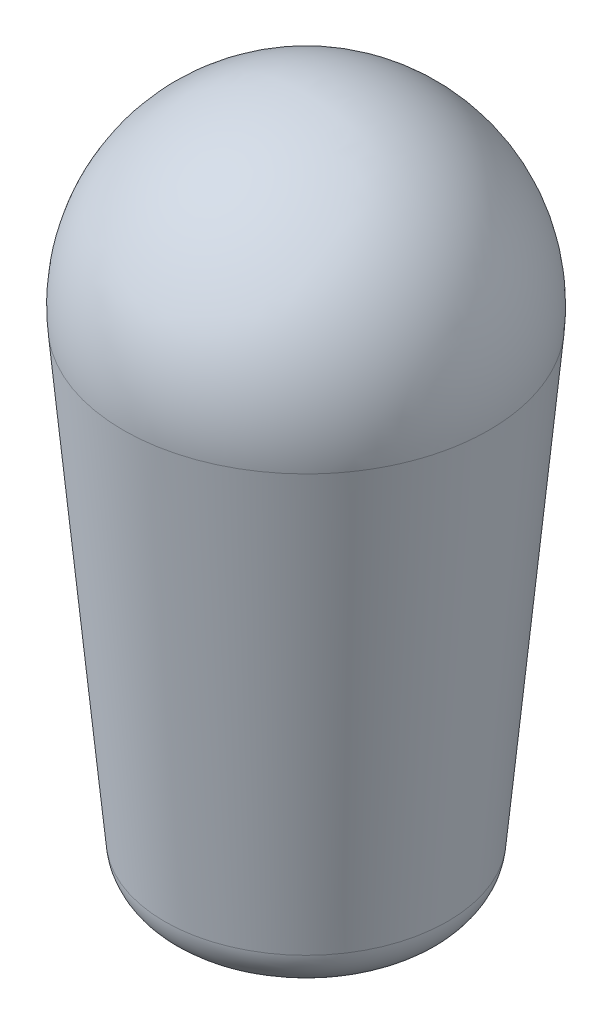
ISO-10303-21;
HEADER;
FILE_DESCRIPTION(('STEP AP214'),'2;1');
FILE_NAME('part.step','',(''),(''),'','','');
FILE_SCHEMA(('AUTOMOTIVE_DESIGN { 1 0 10303 214 1 1 1 1 }'));
ENDSEC;
DATA;
#1=APPLICATION_CONTEXT('core data for automotive mechanical design processes');
#2=APPLICATION_PROTOCOL_DEFINITION('international standard','automotive_design',2000,#1);
#3=PRODUCT_CONTEXT('',#1,'mechanical');
#4=PRODUCT('Part','Part','',(#3));
#5=PRODUCT_RELATED_PRODUCT_CATEGORY('part','',(#4));
#6=PRODUCT_DEFINITION_FORMATION('','',#4);
#7=PRODUCT_DEFINITION_CONTEXT('part definition',#1,'design');
#8=PRODUCT_DEFINITION('design','',#6,#7);
#9=PRODUCT_DEFINITION_SHAPE('','',#8);
#10=(LENGTH_UNIT() NAMED_UNIT(*) SI_UNIT(.MILLI.,.METRE.));
#11=(NAMED_UNIT(*) PLANE_ANGLE_UNIT() SI_UNIT($,.RADIAN.));
#12=(NAMED_UNIT(*) SI_UNIT($,.STERADIAN.) SOLID_ANGLE_UNIT());
#13=UNCERTAINTY_MEASURE_WITH_UNIT(LENGTH_MEASURE(1.E-05),#10,'distance_accuracy_value','');
#14=(GEOMETRIC_REPRESENTATION_CONTEXT(3) GLOBAL_UNCERTAINTY_ASSIGNED_CONTEXT((#13)) GLOBAL_UNIT_ASSIGNED_CONTEXT((#10,
#11,#12)) REPRESENTATION_CONTEXT('',''));
#15=CARTESIAN_POINT('',(0.,0.,0.));
#16=DIRECTION('',(0.,0.,1.));
#17=DIRECTION('',(1.,0.,0.));
#18=AXIS2_PLACEMENT_3D('',#15,#16,#17);
#19=CARTESIAN_POINT('',(0.,-3.,0.));
#20=DIRECTION('',(0.,-1.,0.));
#21=DIRECTION('',(0.,0.,-1.));
#22=AXIS2_PLACEMENT_3D('',#19,#20,#21);
#23=CONICAL_SURFACE('',#22,1.425,1.02974425867665);
#24=CARTESIAN_POINT('',(0.,-2.14377361788573,0.));
#25=VERTEX_POINT('',#24);
#26=VERTEX_LOOP('',#25);
#27=FACE_BOUND('',#26,.T.);
#28=CARTESIAN_POINT('',(0.,-3.,0.));
#29=DIRECTION('',(0.,-1.,0.));
#30=DIRECTION('',(-1.,0.,0.));
#31=AXIS2_PLACEMENT_3D('',#28,#29,#30);
#32=CIRCLE('',#31,1.425);
#33=CARTESIAN_POINT('',(-1.425,-3.,0.));
#34=VERTEX_POINT('',#33);
#35=EDGE_CURVE('E41',#34,#34,#32,.T.);
#36=ORIENTED_EDGE('',*,*,#35,.T.);
#37=EDGE_LOOP('',(#36));
#38=FACE_BOUND('',#37,.T.);
#39=ADVANCED_FACE('F17',(#27,#38),#23,.F.);
#40=CARTESIAN_POINT('',(0.,-11.,0.));
#41=DIRECTION('',(0.,1.,0.));
#42=DIRECTION('',(0.,0.,1.));
#43=AXIS2_PLACEMENT_3D('',#40,#41,#42);
#44=CYLINDRICAL_SURFACE('',#43,1.425);
#45=ORIENTED_EDGE('',*,*,#35,.F.);
#46=EDGE_LOOP('',(#45));
#47=FACE_BOUND('',#46,.T.);
#48=CARTESIAN_POINT('',(0.,-11.,0.));
#49=DIRECTION('',(0.,1.,0.));
#50=DIRECTION('',(0.,0.,1.));
#51=AXIS2_PLACEMENT_3D('',#48,#49,#50);
#52=CIRCLE('',#51,1.425);
#53=CARTESIAN_POINT('',(0.,-11.,1.425));
#54=VERTEX_POINT('',#53);
#55=EDGE_CURVE('E21',#54,#54,#52,.T.);
#56=ORIENTED_EDGE('',*,*,#55,.F.);
#57=EDGE_LOOP('',(#56));
#58=FACE_BOUND('',#57,.T.);
#59=ADVANCED_FACE('F19',(#47,#58),#44,.F.);
#60=CARTESIAN_POINT('',(-1.5,-11.,0.));
#61=DIRECTION('',(0.,-1.,0.));
#62=DIRECTION('',(0.,0.,-1.));
#63=AXIS2_PLACEMENT_3D('',#60,#61,#62);
#64=PLANE('',#63);
#65=ORIENTED_EDGE('',*,*,#55,.T.);
#66=EDGE_LOOP('',(#65));
#67=FACE_BOUND('',#66,.T.);
#68=CARTESIAN_POINT('',(0.,-11.,0.));
#69=DIRECTION('',(0.,1.,0.));
#70=DIRECTION('',(-1.,0.,0.));
#71=AXIS2_PLACEMENT_3D('',#68,#69,#70);
#72=CIRCLE('',#71,2.08819478319791);
#73=CARTESIAN_POINT('',(-2.08819478319791,-11.,0.));
#74=VERTEX_POINT('',#73);
#75=EDGE_CURVE('E45',#74,#74,#72,.T.);
#76=ORIENTED_EDGE('',*,*,#75,.F.);
#77=EDGE_LOOP('',(#76));
#78=FACE_BOUND('',#77,.T.);
#79=ADVANCED_FACE('F67',(#67,#78),#64,.T.);
#80=CARTESIAN_POINT('',(0.,0.,0.));
#81=DIRECTION('',(1.,0.,0.));
#82=DIRECTION('',(0.,1.,0.));
#83=AXIS2_PLACEMENT_3D('',#80,#81,#82);
#84=SPHERICAL_SURFACE('',#83,4.);
#85=CARTESIAN_POINT('',(-4.,0.,0.));
#86=VERTEX_POINT('',#85);
#87=VERTEX_LOOP('',#86);
#88=FACE_BOUND('',#87,.T.);
#89=CARTESIAN_POINT('',(4.,0.,0.));
#90=VERTEX_POINT('',#89);
#91=VERTEX_LOOP('',#90);
#92=FACE_BOUND('',#91,.T.);
#93=CARTESIAN_POINT('',(0.,-0.368269699777102,0.));
#94=DIRECTION('',(0.,1.,0.));
#95=DIRECTION('',(0.,0.,1.));
#96=AXIS2_PLACEMENT_3D('',#93,#94,#95);
#97=CIRCLE('',#96,3.98301110012171);
#98=CARTESIAN_POINT('',(0.,-0.368269699777102,3.98301110012171));
#99=VERTEX_POINT('',#98);
#100=EDGE_CURVE('E27',#99,#99,#97,.F.);
#101=ORIENTED_EDGE('',*,*,#100,.F.);
#102=EDGE_LOOP('',(#101));
#103=FACE_BOUND('',#102,.T.);
#104=ADVANCED_FACE('F76',(#88,#92,#103),#84,.T.);
#105=CARTESIAN_POINT('',(0.,-10.,0.));
#106=DIRECTION('',(0.,1.,0.));
#107=DIRECTION('',(0.,0.,1.));
#108=AXIS2_PLACEMENT_3D('',#105,#106,#107);
#109=TOROIDAL_SURFACE('',#108,2.08819478319791,1.);
#110=CARTESIAN_POINT('',(0.,-10.0920674249778,0.));
#111=DIRECTION('',(0.,1.,0.));
#112=DIRECTION('',(-1.,0.,0.));
#113=AXIS2_PLACEMENT_3D('',#110,#111,#112);
#114=CIRCLE('',#113,3.08394755883512);
#115=CARTESIAN_POINT('',(-3.08394755883512,-10.0920674249778,0.));
#116=VERTEX_POINT('',#115);
#117=EDGE_CURVE('E11',#116,#116,#114,.T.);
#118=ORIENTED_EDGE('',*,*,#117,.F.);
#119=EDGE_LOOP('',(#118));
#120=FACE_BOUND('',#119,.T.);
#121=ORIENTED_EDGE('',*,*,#75,.T.);
#122=EDGE_LOOP('',(#121));
#123=FACE_BOUND('',#122,.T.);
#124=ADVANCED_FACE('F59',(#120,#123),#109,.T.);
#125=CARTESIAN_POINT('',(0.,-0.368269699663415,0.));
#126=DIRECTION('',(0.,1.,0.));
#127=DIRECTION('',(0.,0.,1.));
#128=AXIS2_PLACEMENT_3D('',#125,#126,#127);
#129=CONICAL_SURFACE('',#128,3.98301110013222,0.0921979903750064);
#130=ORIENTED_EDGE('',*,*,#117,.T.);
#131=EDGE_LOOP('',(#130));
#132=FACE_BOUND('',#131,.T.);
#133=ORIENTED_EDGE('',*,*,#100,.T.);
#134=EDGE_LOOP('',(#133));
#135=FACE_BOUND('',#134,.T.);
#136=ADVANCED_FACE('F87',(#132,#135),#129,.T.);
#137=CLOSED_SHELL('',(#39,#59,#79,#104,#124,#136));
#138=MANIFOLD_SOLID_BREP('B1',#137);
#139=ADVANCED_BREP_SHAPE_REPRESENTATION('',(#18,#138),#14);
#140=SHAPE_DEFINITION_REPRESENTATION(#9,#139);
ENDSEC;
END-ISO-10303-21;
